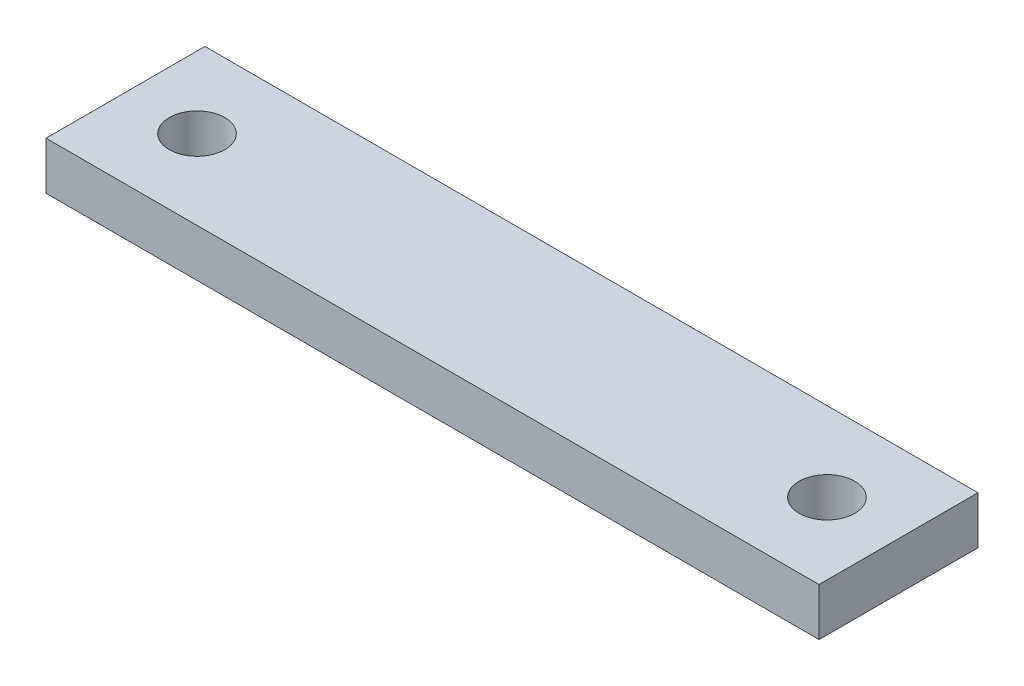
ISO-10303-21;
HEADER;
FILE_DESCRIPTION(('STEP AP214'),'2;1');
FILE_NAME('part.step','',(''),(''),'','','');
FILE_SCHEMA(('AUTOMOTIVE_DESIGN { 1 0 10303 214 1 1 1 1 }'));
ENDSEC;
DATA;
#1=APPLICATION_CONTEXT('core data for automotive mechanical design processes');
#2=APPLICATION_PROTOCOL_DEFINITION('international standard','automotive_design',2000,#1);
#3=PRODUCT_CONTEXT('',#1,'mechanical');
#4=PRODUCT('Part','Part','',(#3));
#5=PRODUCT_RELATED_PRODUCT_CATEGORY('part','',(#4));
#6=PRODUCT_DEFINITION_FORMATION('','',#4);
#7=PRODUCT_DEFINITION_CONTEXT('part definition',#1,'design');
#8=PRODUCT_DEFINITION('design','',#6,#7);
#9=PRODUCT_DEFINITION_SHAPE('','',#8);
#10=(LENGTH_UNIT() NAMED_UNIT(*) SI_UNIT(.MILLI.,.METRE.));
#11=(NAMED_UNIT(*) PLANE_ANGLE_UNIT() SI_UNIT($,.RADIAN.));
#12=(NAMED_UNIT(*) SI_UNIT($,.STERADIAN.) SOLID_ANGLE_UNIT());
#13=UNCERTAINTY_MEASURE_WITH_UNIT(LENGTH_MEASURE(1.E-05),#10,'distance_accuracy_value','');
#14=(GEOMETRIC_REPRESENTATION_CONTEXT(3) GLOBAL_UNCERTAINTY_ASSIGNED_CONTEXT((#13)) GLOBAL_UNIT_ASSIGNED_CONTEXT((#10,
#11,#12)) REPRESENTATION_CONTEXT('',''));
#15=CARTESIAN_POINT('',(0.,0.,0.));
#16=DIRECTION('',(0.,0.,1.));
#17=DIRECTION('',(1.,0.,0.));
#18=AXIS2_PLACEMENT_3D('',#15,#16,#17);
#19=CARTESIAN_POINT('',(-24.315,3.,-5.));
#20=DIRECTION('',(1.,0.,0.));
#21=DIRECTION('',(0.,0.,-1.));
#22=AXIS2_PLACEMENT_3D('',#19,#20,#21);
#23=PLANE('',#22);
#24=DIRECTION('',(0.,0.,1.));
#25=VECTOR('',#24,1.);
#26=CARTESIAN_POINT('',(-24.315,0.,-5.));
#27=LINE('',#26,#25);
#28=CARTESIAN_POINT('',(-24.315,0.,-5.));
#29=VERTEX_POINT('',#28);
#30=CARTESIAN_POINT('',(-24.315,0.,5.));
#31=VERTEX_POINT('',#30);
#32=EDGE_CURVE('E96',#29,#31,#27,.T.);
#33=ORIENTED_EDGE('',*,*,#32,.T.);
#34=DIRECTION('',(0.,-1.,0.));
#35=VECTOR('',#34,1.);
#36=CARTESIAN_POINT('',(-24.315,3.,5.));
#37=LINE('',#36,#35);
#38=CARTESIAN_POINT('',(-24.315,3.,5.));
#39=VERTEX_POINT('',#38);
#40=EDGE_CURVE('E11',#39,#31,#37,.T.);
#41=ORIENTED_EDGE('',*,*,#40,.F.);
#42=DIRECTION('',(0.,0.,1.));
#43=VECTOR('',#42,1.);
#44=CARTESIAN_POINT('',(-24.315,3.,-5.));
#45=LINE('',#44,#43);
#46=CARTESIAN_POINT('',(-24.315,3.,-5.));
#47=VERTEX_POINT('',#46);
#48=EDGE_CURVE('E84',#47,#39,#45,.T.);
#49=ORIENTED_EDGE('',*,*,#48,.F.);
#50=DIRECTION('',(0.,-1.,0.));
#51=VECTOR('',#50,1.);
#52=CARTESIAN_POINT('',(-24.315,3.,-5.));
#53=LINE('',#52,#51);
#54=EDGE_CURVE('E92',#47,#29,#53,.T.);
#55=ORIENTED_EDGE('',*,*,#54,.T.);
#56=EDGE_LOOP('',(#33,#41,#49,#55));
#57=FACE_BOUND('',#56,.T.);
#58=ADVANCED_FACE('F33',(#57),#23,.F.);
#59=CARTESIAN_POINT('',(-24.315,3.,5.));
#60=DIRECTION('',(0.,0.,-1.));
#61=DIRECTION('',(-1.,0.,0.));
#62=AXIS2_PLACEMENT_3D('',#59,#60,#61);
#63=PLANE('',#62);
#64=DIRECTION('',(1.,0.,0.));
#65=VECTOR('',#64,1.);
#66=CARTESIAN_POINT('',(-24.315,0.,5.));
#67=LINE('',#66,#65);
#68=CARTESIAN_POINT('',(24.315,0.,5.));
#69=VERTEX_POINT('',#68);
#70=EDGE_CURVE('E88',#31,#69,#67,.T.);
#71=ORIENTED_EDGE('',*,*,#70,.T.);
#72=DIRECTION('',(0.,-1.,0.));
#73=VECTOR('',#72,1.);
#74=CARTESIAN_POINT('',(24.315,3.,5.));
#75=LINE('',#74,#73);
#76=CARTESIAN_POINT('',(24.315,3.,5.));
#77=VERTEX_POINT('',#76);
#78=EDGE_CURVE('E41',#77,#69,#75,.T.);
#79=ORIENTED_EDGE('',*,*,#78,.F.);
#80=DIRECTION('',(1.,0.,0.));
#81=VECTOR('',#80,1.);
#82=CARTESIAN_POINT('',(-24.315,3.,5.));
#83=LINE('',#82,#81);
#84=EDGE_CURVE('E79',#39,#77,#83,.T.);
#85=ORIENTED_EDGE('',*,*,#84,.F.);
#86=ORIENTED_EDGE('',*,*,#40,.T.);
#87=EDGE_LOOP('',(#71,#79,#85,#86));
#88=FACE_BOUND('',#87,.T.);
#89=ADVANCED_FACE('F87',(#88),#63,.F.);
#90=CARTESIAN_POINT('',(24.315,3.,-5.));
#91=DIRECTION('',(-1.,0.,0.));
#92=DIRECTION('',(0.,0.,1.));
#93=AXIS2_PLACEMENT_3D('',#90,#91,#92);
#94=PLANE('',#93);
#95=DIRECTION('',(0.,0.,-1.));
#96=VECTOR('',#95,1.);
#97=CARTESIAN_POINT('',(24.315,0.,-5.));
#98=LINE('',#97,#96);
#99=CARTESIAN_POINT('',(24.315,0.,-5.));
#100=VERTEX_POINT('',#99);
#101=EDGE_CURVE('E66',#69,#100,#98,.T.);
#102=ORIENTED_EDGE('',*,*,#101,.T.);
#103=DIRECTION('',(0.,-1.,0.));
#104=VECTOR('',#103,1.);
#105=CARTESIAN_POINT('',(24.315,3.,-5.));
#106=LINE('',#105,#104);
#107=CARTESIAN_POINT('',(24.315,3.,-5.));
#108=VERTEX_POINT('',#107);
#109=EDGE_CURVE('E89',#108,#100,#106,.T.);
#110=ORIENTED_EDGE('',*,*,#109,.F.);
#111=DIRECTION('',(0.,0.,-1.));
#112=VECTOR('',#111,1.);
#113=CARTESIAN_POINT('',(24.315,3.,-5.));
#114=LINE('',#113,#112);
#115=EDGE_CURVE('E82',#77,#108,#114,.T.);
#116=ORIENTED_EDGE('',*,*,#115,.F.);
#117=ORIENTED_EDGE('',*,*,#78,.T.);
#118=EDGE_LOOP('',(#102,#110,#116,#117));
#119=FACE_BOUND('',#118,.T.);
#120=ADVANCED_FACE('F90',(#119),#94,.F.);
#121=CARTESIAN_POINT('',(-24.315,3.,-5.));
#122=DIRECTION('',(0.,0.,1.));
#123=DIRECTION('',(1.,0.,0.));
#124=AXIS2_PLACEMENT_3D('',#121,#122,#123);
#125=PLANE('',#124);
#126=DIRECTION('',(-1.,0.,0.));
#127=VECTOR('',#126,1.);
#128=CARTESIAN_POINT('',(-24.315,0.,-5.));
#129=LINE('',#128,#127);
#130=EDGE_CURVE('E72',#100,#29,#129,.T.);
#131=ORIENTED_EDGE('',*,*,#130,.T.);
#132=ORIENTED_EDGE('',*,*,#54,.F.);
#133=DIRECTION('',(-1.,0.,0.));
#134=VECTOR('',#133,1.);
#135=CARTESIAN_POINT('',(-24.315,3.,-5.));
#136=LINE('',#135,#134);
#137=EDGE_CURVE('E49',#108,#47,#136,.T.);
#138=ORIENTED_EDGE('',*,*,#137,.F.);
#139=ORIENTED_EDGE('',*,*,#109,.T.);
#140=EDGE_LOOP('',(#131,#132,#138,#139));
#141=FACE_BOUND('',#140,.T.);
#142=ADVANCED_FACE('F104',(#141),#125,.F.);
#143=CARTESIAN_POINT('',(0.,3.,0.));
#144=DIRECTION('',(0.,1.,0.));
#145=DIRECTION('',(0.,0.,1.));
#146=AXIS2_PLACEMENT_3D('',#143,#144,#145);
#147=PLANE('',#146);
#148=CARTESIAN_POINT('',(-19.815,3.,0.));
#149=DIRECTION('',(0.,1.,0.));
#150=DIRECTION('',(0.,0.,1.));
#151=AXIS2_PLACEMENT_3D('',#148,#149,#150);
#152=CIRCLE('',#151,1.75);
#153=CARTESIAN_POINT('',(-19.815,3.,1.75));
#154=VERTEX_POINT('',#153);
#155=EDGE_CURVE('E116',#154,#154,#152,.T.);
#156=ORIENTED_EDGE('',*,*,#155,.F.);
#157=EDGE_LOOP('',(#156));
#158=FACE_BOUND('',#157,.T.);
#159=CARTESIAN_POINT('',(19.8134862,3.,0.));
#160=DIRECTION('',(0.,1.,0.));
#161=DIRECTION('',(0.,0.,1.));
#162=AXIS2_PLACEMENT_3D('',#159,#160,#161);
#163=CIRCLE('',#162,1.75);
#164=CARTESIAN_POINT('',(19.8134862,3.,1.75));
#165=VERTEX_POINT('',#164);
#166=EDGE_CURVE('E110',#165,#165,#163,.T.);
#167=ORIENTED_EDGE('',*,*,#166,.F.);
#168=EDGE_LOOP('',(#167));
#169=FACE_BOUND('',#168,.T.);
#170=ORIENTED_EDGE('',*,*,#48,.T.);
#171=ORIENTED_EDGE('',*,*,#84,.T.);
#172=ORIENTED_EDGE('',*,*,#115,.T.);
#173=ORIENTED_EDGE('',*,*,#137,.T.);
#174=EDGE_LOOP('',(#170,#171,#172,#173));
#175=FACE_BOUND('',#174,.T.);
#176=ADVANCED_FACE('F80',(#158,#169,#175),#147,.T.);
#177=CARTESIAN_POINT('',(0.,0.,0.));
#178=DIRECTION('',(0.,1.,0.));
#179=DIRECTION('',(0.,0.,1.));
#180=AXIS2_PLACEMENT_3D('',#177,#178,#179);
#181=PLANE('',#180);
#182=CARTESIAN_POINT('',(-19.815,0.,0.));
#183=DIRECTION('',(0.,1.,0.));
#184=DIRECTION('',(0.,0.,1.));
#185=AXIS2_PLACEMENT_3D('',#182,#183,#184);
#186=CIRCLE('',#185,1.75);
#187=CARTESIAN_POINT('',(-19.815,0.,1.75));
#188=VERTEX_POINT('',#187);
#189=EDGE_CURVE('E99',#188,#188,#186,.T.);
#190=ORIENTED_EDGE('',*,*,#189,.T.);
#191=EDGE_LOOP('',(#190));
#192=FACE_BOUND('',#191,.T.);
#193=CARTESIAN_POINT('',(19.8134862,0.,0.));
#194=DIRECTION('',(0.,1.,0.));
#195=DIRECTION('',(0.,0.,1.));
#196=AXIS2_PLACEMENT_3D('',#193,#194,#195);
#197=CIRCLE('',#196,1.75);
#198=CARTESIAN_POINT('',(19.8134862,0.,1.75));
#199=VERTEX_POINT('',#198);
#200=EDGE_CURVE('E113',#199,#199,#197,.T.);
#201=ORIENTED_EDGE('',*,*,#200,.T.);
#202=EDGE_LOOP('',(#201));
#203=FACE_BOUND('',#202,.T.);
#204=ORIENTED_EDGE('',*,*,#32,.F.);
#205=ORIENTED_EDGE('',*,*,#130,.F.);
#206=ORIENTED_EDGE('',*,*,#101,.F.);
#207=ORIENTED_EDGE('',*,*,#70,.F.);
#208=EDGE_LOOP('',(#204,#205,#206,#207));
#209=FACE_BOUND('',#208,.T.);
#210=ADVANCED_FACE('F107',(#192,#203,#209),#181,.F.);
#211=CARTESIAN_POINT('',(19.8134862,0.,0.));
#212=DIRECTION('',(0.,1.,0.));
#213=DIRECTION('',(0.,0.,1.));
#214=AXIS2_PLACEMENT_3D('',#211,#212,#213);
#215=CYLINDRICAL_SURFACE('',#214,1.75);
#216=ORIENTED_EDGE('',*,*,#200,.F.);
#217=EDGE_LOOP('',(#216));
#218=FACE_BOUND('',#217,.T.);
#219=ORIENTED_EDGE('',*,*,#166,.T.);
#220=EDGE_LOOP('',(#219));
#221=FACE_BOUND('',#220,.T.);
#222=ADVANCED_FACE('F127',(#218,#221),#215,.F.);
#223=CARTESIAN_POINT('',(-19.815,0.,0.));
#224=DIRECTION('',(0.,1.,0.));
#225=DIRECTION('',(0.,0.,1.));
#226=AXIS2_PLACEMENT_3D('',#223,#224,#225);
#227=CYLINDRICAL_SURFACE('',#226,1.75);
#228=ORIENTED_EDGE('',*,*,#189,.F.);
#229=EDGE_LOOP('',(#228));
#230=FACE_BOUND('',#229,.T.);
#231=ORIENTED_EDGE('',*,*,#155,.T.);
#232=EDGE_LOOP('',(#231));
#233=FACE_BOUND('',#232,.T.);
#234=ADVANCED_FACE('F124',(#230,#233),#227,.F.);
#235=CLOSED_SHELL('',(#58,#89,#120,#142,#176,#210,#222,#234));
#236=MANIFOLD_SOLID_BREP('B2',#235);
#237=ADVANCED_BREP_SHAPE_REPRESENTATION('',(#18,#236),#14);
#238=SHAPE_DEFINITION_REPRESENTATION(#9,#237);
ENDSEC;
END-ISO-10303-21;
